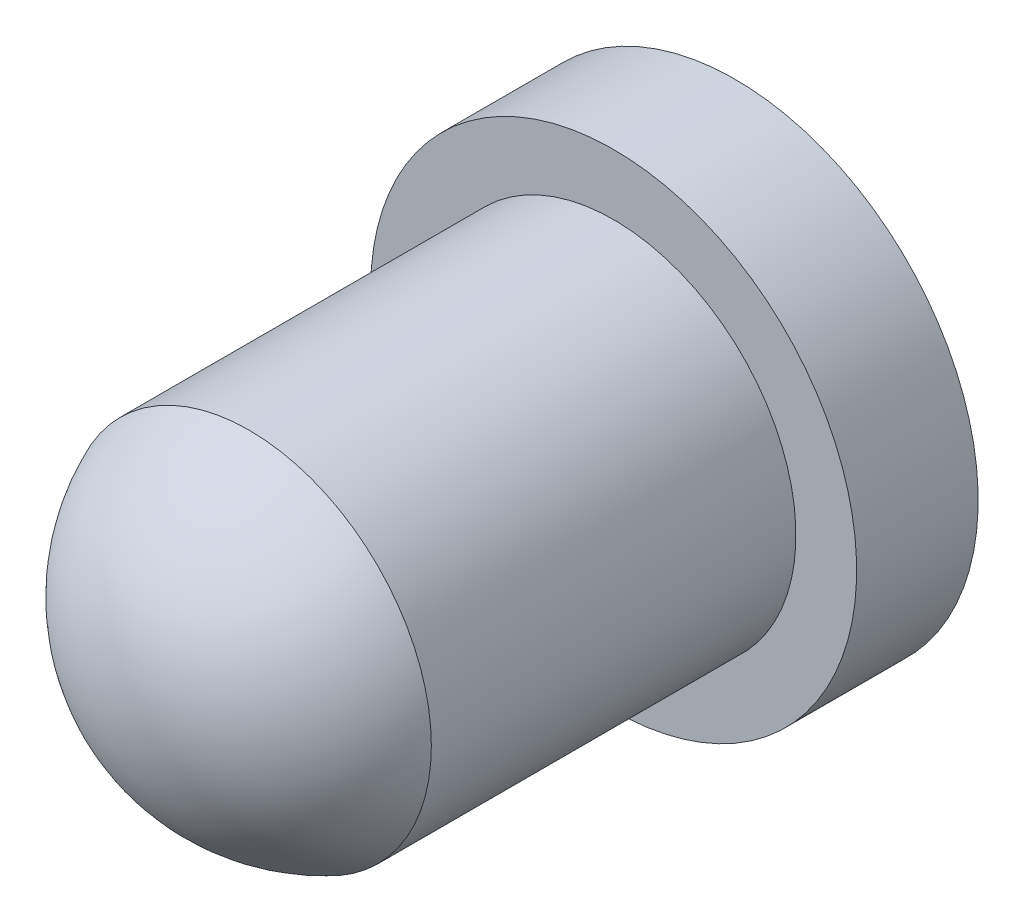
ISO-10303-21;
HEADER;
FILE_DESCRIPTION(('STEP AP214'),'2;1');
FILE_NAME('part.step','',(''),(''),'','','');
FILE_SCHEMA(('AUTOMOTIVE_DESIGN { 1 0 10303 214 1 1 1 1 }'));
ENDSEC;
DATA;
#1=APPLICATION_CONTEXT('core data for automotive mechanical design processes');
#2=APPLICATION_PROTOCOL_DEFINITION('international standard','automotive_design',2000,#1);
#3=PRODUCT_CONTEXT('',#1,'mechanical');
#4=PRODUCT('Part','Part','',(#3));
#5=PRODUCT_RELATED_PRODUCT_CATEGORY('part','',(#4));
#6=PRODUCT_DEFINITION_FORMATION('','',#4);
#7=PRODUCT_DEFINITION_CONTEXT('part definition',#1,'design');
#8=PRODUCT_DEFINITION('design','',#6,#7);
#9=PRODUCT_DEFINITION_SHAPE('','',#8);
#10=(LENGTH_UNIT() NAMED_UNIT(*) SI_UNIT(.MILLI.,.METRE.));
#11=(NAMED_UNIT(*) PLANE_ANGLE_UNIT() SI_UNIT($,.RADIAN.));
#12=(NAMED_UNIT(*) SI_UNIT($,.STERADIAN.) SOLID_ANGLE_UNIT());
#13=UNCERTAINTY_MEASURE_WITH_UNIT(LENGTH_MEASURE(1.E-05),#10,'distance_accuracy_value','');
#14=(GEOMETRIC_REPRESENTATION_CONTEXT(3) GLOBAL_UNCERTAINTY_ASSIGNED_CONTEXT((#13)) GLOBAL_UNIT_ASSIGNED_CONTEXT((#10,
#11,#12)) REPRESENTATION_CONTEXT('',''));
#15=CARTESIAN_POINT('',(0.,0.,0.));
#16=DIRECTION('',(0.,0.,1.));
#17=DIRECTION('',(1.,0.,0.));
#18=AXIS2_PLACEMENT_3D('',#15,#16,#17);
#19=CARTESIAN_POINT('',(0.,0.,3.));
#20=DIRECTION('',(0.,0.,-1.));
#21=DIRECTION('',(-1.,0.,0.));
#22=AXIS2_PLACEMENT_3D('',#19,#20,#21);
#23=CYLINDRICAL_SURFACE('',#22,1.5);
#24=CARTESIAN_POINT('',(0.,0.,3.));
#25=DIRECTION('',(0.,0.,1.));
#26=DIRECTION('',(1.,0.,0.));
#27=AXIS2_PLACEMENT_3D('',#24,#25,#26);
#28=CIRCLE('',#27,1.5);
#29=CARTESIAN_POINT('',(1.5,0.,3.));
#30=VERTEX_POINT('',#29);
#31=EDGE_CURVE('E10',#30,#30,#28,.T.);
#32=ORIENTED_EDGE('',*,*,#31,.F.);
#33=EDGE_LOOP('',(#32));
#34=FACE_BOUND('',#33,.T.);
#35=CARTESIAN_POINT('',(0.,0.,0.));
#36=DIRECTION('',(0.,0.,-1.));
#37=DIRECTION('',(-1.,0.,0.));
#38=AXIS2_PLACEMENT_3D('',#35,#36,#37);
#39=CIRCLE('',#38,1.5);
#40=CARTESIAN_POINT('',(-1.5,0.,0.));
#41=VERTEX_POINT('',#40);
#42=EDGE_CURVE('E39',#41,#41,#39,.T.);
#43=ORIENTED_EDGE('',*,*,#42,.F.);
#44=EDGE_LOOP('',(#43));
#45=FACE_BOUND('',#44,.T.);
#46=ADVANCED_FACE('F32',(#34,#45),#23,.T.);
#47=CARTESIAN_POINT('',(0.,0.,2.375));
#48=DIRECTION('',(0.,0.,1.));
#49=DIRECTION('',(1.,0.,0.));
#50=AXIS2_PLACEMENT_3D('',#47,#48,#49);
#51=SPHERICAL_SURFACE('',#50,1.625);
#52=ORIENTED_EDGE('',*,*,#31,.T.);
#53=EDGE_LOOP('',(#52));
#54=FACE_BOUND('',#53,.T.);
#55=ADVANCED_FACE('F34',(#54),#51,.T.);
#56=CARTESIAN_POINT('',(0.,0.,0.));
#57=DIRECTION('',(0.,0.,-1.));
#58=DIRECTION('',(-1.,0.,0.));
#59=AXIS2_PLACEMENT_3D('',#56,#57,#58);
#60=PLANE('',#59);
#61=CARTESIAN_POINT('',(0.,0.,0.));
#62=DIRECTION('',(0.,0.,-1.));
#63=DIRECTION('',(-1.,0.,0.));
#64=AXIS2_PLACEMENT_3D('',#61,#62,#63);
#65=CIRCLE('',#64,2.);
#66=CARTESIAN_POINT('',(-2.,0.,0.));
#67=VERTEX_POINT('',#66);
#68=EDGE_CURVE('E47',#67,#67,#65,.T.);
#69=ORIENTED_EDGE('',*,*,#68,.F.);
#70=EDGE_LOOP('',(#69));
#71=FACE_BOUND('',#70,.T.);
#72=ORIENTED_EDGE('',*,*,#42,.T.);
#73=EDGE_LOOP('',(#72));
#74=FACE_BOUND('',#73,.T.);
#75=ADVANCED_FACE('F55',(#71,#74),#60,.F.);
#76=CARTESIAN_POINT('',(0.,0.,-1.));
#77=DIRECTION('',(0.,0.,1.));
#78=DIRECTION('',(1.,0.,0.));
#79=AXIS2_PLACEMENT_3D('',#76,#77,#78);
#80=CYLINDRICAL_SURFACE('',#79,2.);
#81=CARTESIAN_POINT('',(0.,0.,-1.));
#82=DIRECTION('',(0.,0.,-1.));
#83=DIRECTION('',(-1.,0.,0.));
#84=AXIS2_PLACEMENT_3D('',#81,#82,#83);
#85=CIRCLE('',#84,2.);
#86=CARTESIAN_POINT('',(-2.,0.,-1.));
#87=VERTEX_POINT('',#86);
#88=EDGE_CURVE('E43',#87,#87,#85,.T.);
#89=ORIENTED_EDGE('',*,*,#88,.F.);
#90=EDGE_LOOP('',(#89));
#91=FACE_BOUND('',#90,.T.);
#92=ORIENTED_EDGE('',*,*,#68,.T.);
#93=EDGE_LOOP('',(#92));
#94=FACE_BOUND('',#93,.T.);
#95=ADVANCED_FACE('F53',(#91,#94),#80,.T.);
#96=CARTESIAN_POINT('',(0.,0.,-1.));
#97=DIRECTION('',(0.,0.,-1.));
#98=DIRECTION('',(-1.,0.,0.));
#99=AXIS2_PLACEMENT_3D('',#96,#97,#98);
#100=PLANE('',#99);
#101=ORIENTED_EDGE('',*,*,#88,.T.);
#102=EDGE_LOOP('',(#101));
#103=FACE_BOUND('',#102,.T.);
#104=ADVANCED_FACE('F62',(#103),#100,.T.);
#105=CLOSED_SHELL('',(#46,#55,#75,#95,#104));
#106=MANIFOLD_SOLID_BREP('B2',#105);
#107=ADVANCED_BREP_SHAPE_REPRESENTATION('',(#18,#106),#14);
#108=SHAPE_DEFINITION_REPRESENTATION(#9,#107);
ENDSEC;
END-ISO-10303-21;
